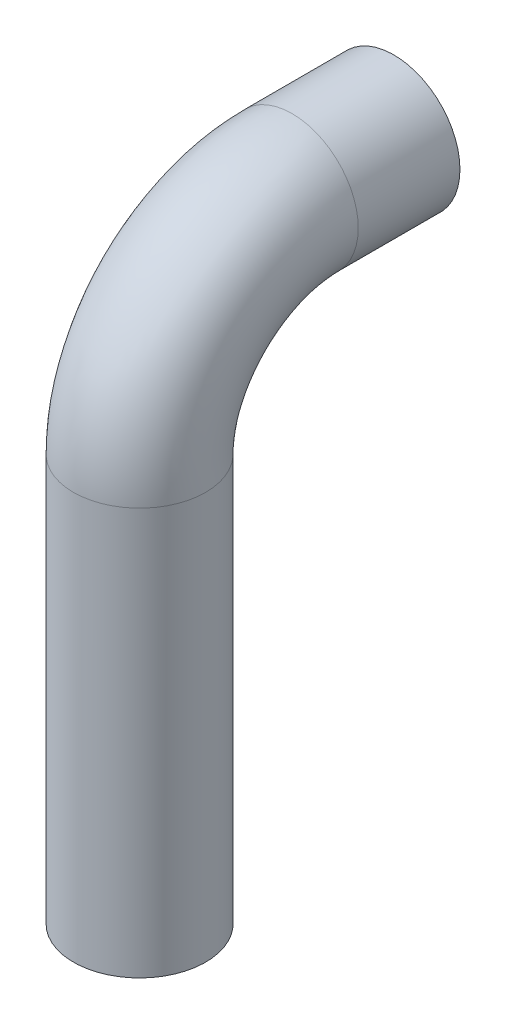
ISO-10303-21;
HEADER;
FILE_DESCRIPTION(('STEP AP214'),'2;1');
FILE_NAME('part.step','',(''),(''),'','','');
FILE_SCHEMA(('AUTOMOTIVE_DESIGN { 1 0 10303 214 1 1 1 1 }'));
ENDSEC;
DATA;
#1=APPLICATION_CONTEXT('core data for automotive mechanical design processes');
#2=APPLICATION_PROTOCOL_DEFINITION('international standard','automotive_design',2000,#1);
#3=PRODUCT_CONTEXT('',#1,'mechanical');
#4=PRODUCT('Part','Part','',(#3));
#5=PRODUCT_RELATED_PRODUCT_CATEGORY('part','',(#4));
#6=PRODUCT_DEFINITION_FORMATION('','',#4);
#7=PRODUCT_DEFINITION_CONTEXT('part definition',#1,'design');
#8=PRODUCT_DEFINITION('design','',#6,#7);
#9=PRODUCT_DEFINITION_SHAPE('','',#8);
#10=(LENGTH_UNIT() NAMED_UNIT(*) SI_UNIT(.MILLI.,.METRE.));
#11=(NAMED_UNIT(*) PLANE_ANGLE_UNIT() SI_UNIT($,.RADIAN.));
#12=(NAMED_UNIT(*) SI_UNIT($,.STERADIAN.) SOLID_ANGLE_UNIT());
#13=UNCERTAINTY_MEASURE_WITH_UNIT(LENGTH_MEASURE(1.E-05),#10,'distance_accuracy_value','');
#14=(GEOMETRIC_REPRESENTATION_CONTEXT(3) GLOBAL_UNCERTAINTY_ASSIGNED_CONTEXT((#13)) GLOBAL_UNIT_ASSIGNED_CONTEXT((#10,
#11,#12)) REPRESENTATION_CONTEXT('',''));
#15=CARTESIAN_POINT('',(0.,0.,0.));
#16=DIRECTION('',(0.,0.,1.));
#17=DIRECTION('',(1.,0.,0.));
#18=AXIS2_PLACEMENT_3D('',#15,#16,#17);
#19=CARTESIAN_POINT('',(0.,33.4567495717997,0.));
#20=DIRECTION('',(0.,0.,1.));
#21=DIRECTION('',(1.,0.,0.));
#22=AXIS2_PLACEMENT_3D('',#19,#20,#21);
#23=PLANE('',#22);
#24=CARTESIAN_POINT('',(0.,33.4567495717997,0.));
#25=DIRECTION('',(0.,0.,1.));
#26=DIRECTION('',(1.,0.,0.));
#27=AXIS2_PLACEMENT_3D('',#24,#25,#26);
#28=CIRCLE('',#27,10.);
#29=CARTESIAN_POINT('',(10.,33.4567495717997,0.));
#30=VERTEX_POINT('',#29);
#31=EDGE_CURVE('E68',#30,#30,#28,.T.);
#32=ORIENTED_EDGE('',*,*,#31,.T.);
#33=EDGE_LOOP('',(#32));
#34=FACE_BOUND('',#33,.T.);
#35=CARTESIAN_POINT('',(0.,33.4567495717997,0.));
#36=DIRECTION('',(0.,0.,1.));
#37=DIRECTION('',(1.,0.,0.));
#38=AXIS2_PLACEMENT_3D('',#35,#36,#37);
#39=CIRCLE('',#38,13.);
#40=CARTESIAN_POINT('',(13.,33.4567495717997,0.));
#41=VERTEX_POINT('',#40);
#42=EDGE_CURVE('E51',#41,#41,#39,.T.);
#43=ORIENTED_EDGE('',*,*,#42,.F.);
#44=EDGE_LOOP('',(#43));
#45=FACE_BOUND('',#44,.T.);
#46=ADVANCED_FACE('F35',(#34,#45),#23,.F.);
#47=CARTESIAN_POINT('',(0.,-76.5432504282003,50.));
#48=DIRECTION('',(0.,-1.,0.));
#49=DIRECTION('',(1.,0.,0.));
#50=AXIS2_PLACEMENT_3D('',#47,#48,#49);
#51=PLANE('',#50);
#52=CARTESIAN_POINT('',(0.,-76.5432504282003,50.));
#53=DIRECTION('',(0.,-1.,0.));
#54=DIRECTION('',(1.,0.,0.));
#55=AXIS2_PLACEMENT_3D('',#52,#53,#54);
#56=CIRCLE('',#55,10.);
#57=CARTESIAN_POINT('',(10.,-76.5432504282003,50.));
#58=VERTEX_POINT('',#57);
#59=EDGE_CURVE('E55',#58,#58,#56,.T.);
#60=ORIENTED_EDGE('',*,*,#59,.F.);
#61=EDGE_LOOP('',(#60));
#62=FACE_BOUND('',#61,.T.);
#63=CARTESIAN_POINT('',(0.,-76.5432504282003,50.));
#64=DIRECTION('',(0.,-1.,0.));
#65=DIRECTION('',(0.,0.,-1.));
#66=AXIS2_PLACEMENT_3D('',#63,#64,#65);
#67=CIRCLE('',#66,13.);
#68=CARTESIAN_POINT('',(0.,-76.5432504282003,37.));
#69=VERTEX_POINT('',#68);
#70=EDGE_CURVE('E10',#69,#69,#67,.T.);
#71=ORIENTED_EDGE('',*,*,#70,.T.);
#72=EDGE_LOOP('',(#71));
#73=FACE_BOUND('',#72,.T.);
#74=ADVANCED_FACE('F91',(#62,#73),#51,.T.);
#75=CARTESIAN_POINT('',(0.,33.4567495717997,0.));
#76=DIRECTION('',(0.,0.,1.));
#77=DIRECTION('',(1.,0.,0.));
#78=AXIS2_PLACEMENT_3D('',#75,#76,#77);
#79=CYLINDRICAL_SURFACE('',#78,13.);
#80=CARTESIAN_POINT('',(0.,33.4567495717997,20.));
#81=DIRECTION('',(0.,0.,-1.));
#82=DIRECTION('',(0.,1.,0.));
#83=AXIS2_PLACEMENT_3D('',#80,#81,#82);
#84=CIRCLE('',#83,13.);
#85=CARTESIAN_POINT('',(0.,46.4567495717997,20.));
#86=VERTEX_POINT('',#85);
#87=EDGE_CURVE('E46',#86,#86,#84,.F.);
#88=ORIENTED_EDGE('',*,*,#87,.F.);
#89=EDGE_LOOP('',(#88));
#90=FACE_BOUND('',#89,.T.);
#91=ORIENTED_EDGE('',*,*,#42,.T.);
#92=EDGE_LOOP('',(#91));
#93=FACE_BOUND('',#92,.T.);
#94=ADVANCED_FACE('F94',(#90,#93),#79,.T.);
#95=CARTESIAN_POINT('',(0.,3.45674957179974,20.));
#96=DIRECTION('',(1.,0.,0.));
#97=DIRECTION('',(0.,0.,-1.));
#98=AXIS2_PLACEMENT_3D('',#95,#96,#97);
#99=TOROIDAL_SURFACE('',#98,30.,13.);
#100=CARTESIAN_POINT('',(0.,3.45674957179974,50.));
#101=DIRECTION('',(0.,-1.,0.));
#102=DIRECTION('',(0.,0.,-1.));
#103=AXIS2_PLACEMENT_3D('',#100,#101,#102);
#104=CIRCLE('',#103,13.);
#105=CARTESIAN_POINT('',(0.,3.45674957179974,63.));
#106=VERTEX_POINT('',#105);
#107=EDGE_CURVE('E42',#106,#106,#104,.T.);
#108=CARTESIAN_POINT('',(0.,3.45674957179974,20.));
#109=DIRECTION('',(1.,0.,0.));
#110=DIRECTION('',(0.,0.,-1.));
#111=AXIS2_PLACEMENT_3D('',#108,#109,#110);
#112=CIRCLE('',#111,43.);
#113=EDGE_CURVE('',#86,#106,#112,.T.);
#114=ORIENTED_EDGE('',*,*,#87,.T.);
#115=ORIENTED_EDGE('',*,*,#107,.F.);
#116=ORIENTED_EDGE('',*,*,#113,.T.);
#117=ORIENTED_EDGE('',*,*,#113,.F.);
#118=EDGE_LOOP('',(#114,#116,#115,#117));
#119=FACE_BOUND('',#118,.T.);
#120=ADVANCED_FACE('F86',(#119),#99,.T.);
#121=CARTESIAN_POINT('',(0.,3.45674957179974,50.));
#122=DIRECTION('',(0.,-1.,0.));
#123=DIRECTION('',(0.,0.,-1.));
#124=AXIS2_PLACEMENT_3D('',#121,#122,#123);
#125=CYLINDRICAL_SURFACE('',#124,13.);
#126=ORIENTED_EDGE('',*,*,#70,.F.);
#127=EDGE_LOOP('',(#126));
#128=FACE_BOUND('',#127,.T.);
#129=ORIENTED_EDGE('',*,*,#107,.T.);
#130=EDGE_LOOP('',(#129));
#131=FACE_BOUND('',#130,.T.);
#132=ADVANCED_FACE('F37',(#128,#131),#125,.T.);
#133=CARTESIAN_POINT('',(0.,33.4567495717997,0.));
#134=DIRECTION('',(0.,0.,1.));
#135=DIRECTION('',(1.,0.,0.));
#136=AXIS2_PLACEMENT_3D('',#133,#134,#135);
#137=CYLINDRICAL_SURFACE('',#136,10.);
#138=CARTESIAN_POINT('',(0.,33.4567495717997,20.));
#139=DIRECTION('',(0.,0.,1.));
#140=DIRECTION('',(1.,0.,0.));
#141=AXIS2_PLACEMENT_3D('',#138,#139,#140);
#142=CIRCLE('',#141,10.);
#143=CARTESIAN_POINT('',(0.,43.4567495717997,20.));
#144=VERTEX_POINT('',#143);
#145=EDGE_CURVE('E63',#144,#144,#142,.T.);
#146=ORIENTED_EDGE('',*,*,#145,.T.);
#147=EDGE_LOOP('',(#146));
#148=FACE_BOUND('',#147,.T.);
#149=ORIENTED_EDGE('',*,*,#31,.F.);
#150=EDGE_LOOP('',(#149));
#151=FACE_BOUND('',#150,.T.);
#152=ADVANCED_FACE('F74',(#148,#151),#137,.F.);
#153=CARTESIAN_POINT('',(0.,3.45674957179974,20.));
#154=DIRECTION('',(1.,0.,0.));
#155=DIRECTION('',(0.,0.,-1.));
#156=AXIS2_PLACEMENT_3D('',#153,#154,#155);
#157=TOROIDAL_SURFACE('',#156,30.,10.);
#158=CARTESIAN_POINT('',(0.,3.45674957179974,50.));
#159=DIRECTION('',(0.,-1.,0.));
#160=DIRECTION('',(1.,0.,0.));
#161=AXIS2_PLACEMENT_3D('',#158,#159,#160);
#162=CIRCLE('',#161,10.);
#163=CARTESIAN_POINT('',(0.,3.45674957179974,60.));
#164=VERTEX_POINT('',#163);
#165=EDGE_CURVE('E59',#164,#164,#162,.T.);
#166=CARTESIAN_POINT('',(0.,3.45674957179974,20.));
#167=DIRECTION('',(1.,0.,0.));
#168=DIRECTION('',(0.,0.,-1.));
#169=AXIS2_PLACEMENT_3D('',#166,#167,#168);
#170=CIRCLE('',#169,40.);
#171=EDGE_CURVE('',#144,#164,#170,.T.);
#172=ORIENTED_EDGE('',*,*,#145,.F.);
#173=ORIENTED_EDGE('',*,*,#165,.T.);
#174=ORIENTED_EDGE('',*,*,#171,.T.);
#175=ORIENTED_EDGE('',*,*,#171,.F.);
#176=EDGE_LOOP('',(#172,#174,#173,#175));
#177=FACE_BOUND('',#176,.T.);
#178=ADVANCED_FACE('F76',(#177),#157,.F.);
#179=CARTESIAN_POINT('',(0.,3.45674957179974,50.));
#180=DIRECTION('',(0.,-1.,0.));
#181=DIRECTION('',(0.,0.,-1.));
#182=AXIS2_PLACEMENT_3D('',#179,#180,#181);
#183=CYLINDRICAL_SURFACE('',#182,10.);
#184=ORIENTED_EDGE('',*,*,#59,.T.);
#185=EDGE_LOOP('',(#184));
#186=FACE_BOUND('',#185,.T.);
#187=ORIENTED_EDGE('',*,*,#165,.F.);
#188=EDGE_LOOP('',(#187));
#189=FACE_BOUND('',#188,.T.);
#190=ADVANCED_FACE('F83',(#186,#189),#183,.F.);
#191=CLOSED_SHELL('',(#46,#74,#94,#120,#132,#152,#178,#190));
#192=MANIFOLD_SOLID_BREP('B2',#191);
#193=ADVANCED_BREP_SHAPE_REPRESENTATION('',(#18,#192),#14);
#194=SHAPE_DEFINITION_REPRESENTATION(#9,#193);
ENDSEC;
END-ISO-10303-21;
